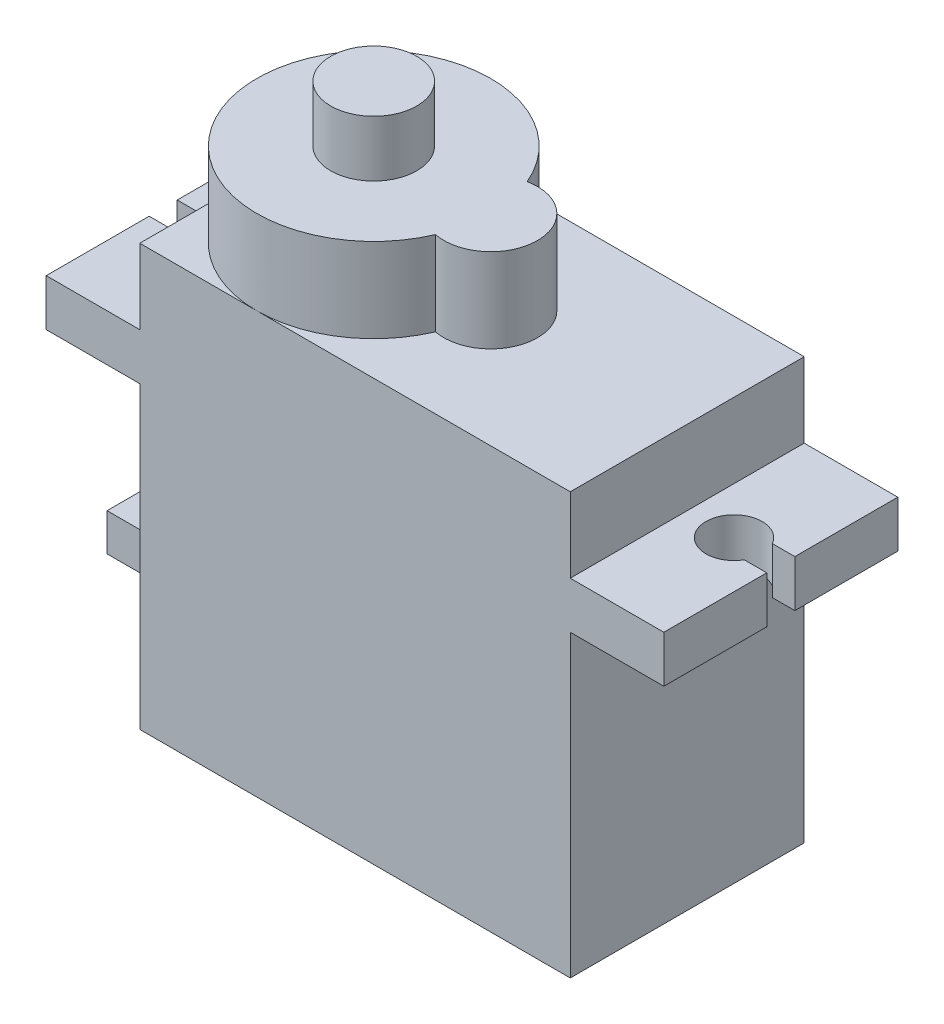
ISO-10303-21;
HEADER;
FILE_DESCRIPTION(('STEP AP214'),'2;1');
FILE_NAME('part.step','',(''),(''),'','','');
FILE_SCHEMA(('AUTOMOTIVE_DESIGN { 1 0 10303 214 1 1 1 1 }'));
ENDSEC;
DATA;
#1=APPLICATION_CONTEXT('core data for automotive mechanical design processes');
#2=APPLICATION_PROTOCOL_DEFINITION('international standard','automotive_design',2000,#1);
#3=PRODUCT_CONTEXT('',#1,'mechanical');
#4=PRODUCT('Part','Part','',(#3));
#5=PRODUCT_RELATED_PRODUCT_CATEGORY('part','',(#4));
#6=PRODUCT_DEFINITION_FORMATION('','',#4);
#7=PRODUCT_DEFINITION_CONTEXT('part definition',#1,'design');
#8=PRODUCT_DEFINITION('design','',#6,#7);
#9=PRODUCT_DEFINITION_SHAPE('','',#8);
#10=(LENGTH_UNIT() NAMED_UNIT(*) SI_UNIT(.MILLI.,.METRE.));
#11=(NAMED_UNIT(*) PLANE_ANGLE_UNIT() SI_UNIT($,.RADIAN.));
#12=(NAMED_UNIT(*) SI_UNIT($,.STERADIAN.) SOLID_ANGLE_UNIT());
#13=UNCERTAINTY_MEASURE_WITH_UNIT(LENGTH_MEASURE(1.E-05),#10,'distance_accuracy_value','');
#14=(GEOMETRIC_REPRESENTATION_CONTEXT(3) GLOBAL_UNCERTAINTY_ASSIGNED_CONTEXT((#13)) GLOBAL_UNIT_ASSIGNED_CONTEXT((#10,
#11,#12)) REPRESENTATION_CONTEXT('',''));
#15=CARTESIAN_POINT('',(0.,0.,0.));
#16=DIRECTION('',(0.,0.,1.));
#17=DIRECTION('',(1.,0.,0.));
#18=AXIS2_PLACEMENT_3D('',#15,#16,#17);
#19=CARTESIAN_POINT('',(-11.5,22.5,6.25));
#20=DIRECTION('',(1.,0.,0.));
#21=DIRECTION('',(0.,0.,-1.));
#22=AXIS2_PLACEMENT_3D('',#19,#20,#21);
#23=PLANE('',#22);
#24=DIRECTION('',(0.,-1.,0.));
#25=VECTOR('',#24,1.);
#26=CARTESIAN_POINT('',(-11.5,22.5,6.25));
#27=LINE('',#26,#25);
#28=CARTESIAN_POINT('',(-11.5,16.,6.25));
#29=VERTEX_POINT('',#28);
#30=CARTESIAN_POINT('',(-11.5,0.,6.25));
#31=VERTEX_POINT('',#30);
#32=EDGE_CURVE('E411',#29,#31,#27,.T.);
#33=ORIENTED_EDGE('',*,*,#32,.F.);
#34=DIRECTION('',(0.,0.,-1.));
#35=VECTOR('',#34,1.);
#36=CARTESIAN_POINT('',(-11.5,16.,-6.25));
#37=LINE('',#36,#35);
#38=CARTESIAN_POINT('',(-11.5,16.,-6.25));
#39=VERTEX_POINT('',#38);
#40=EDGE_CURVE('E328',#29,#39,#37,.T.);
#41=ORIENTED_EDGE('',*,*,#40,.T.);
#42=DIRECTION('',(0.,-1.,0.));
#43=VECTOR('',#42,1.);
#44=CARTESIAN_POINT('',(-11.5,22.5,-6.25));
#45=LINE('',#44,#43);
#46=CARTESIAN_POINT('',(-11.5,0.,-6.25));
#47=VERTEX_POINT('',#46);
#48=EDGE_CURVE('E392',#39,#47,#45,.T.);
#49=ORIENTED_EDGE('',*,*,#48,.T.);
#50=DIRECTION('',(0.,0.,1.));
#51=VECTOR('',#50,1.);
#52=CARTESIAN_POINT('',(-11.5,0.,6.25));
#53=LINE('',#52,#51);
#54=EDGE_CURVE('E378',#47,#31,#53,.T.);
#55=ORIENTED_EDGE('',*,*,#54,.T.);
#56=EDGE_LOOP('',(#33,#41,#49,#55));
#57=FACE_BOUND('',#56,.T.);
#58=DIRECTION('',(0.,1.,0.));
#59=VECTOR('',#58,1.);
#60=CARTESIAN_POINT('',(-11.5,4.,3.));
#61=LINE('',#60,#59);
#62=CARTESIAN_POINT('',(-11.5,4.,3.));
#63=VERTEX_POINT('',#62);
#64=CARTESIAN_POINT('',(-11.5,6.,3.));
#65=VERTEX_POINT('',#64);
#66=EDGE_CURVE('E243',#63,#65,#61,.T.);
#67=ORIENTED_EDGE('',*,*,#66,.F.);
#68=DIRECTION('',(0.,0.,-1.));
#69=VECTOR('',#68,1.);
#70=CARTESIAN_POINT('',(-11.5,4.,3.));
#71=LINE('',#70,#69);
#72=CARTESIAN_POINT('',(-11.5,4.,-3.));
#73=VERTEX_POINT('',#72);
#74=EDGE_CURVE('E239',#63,#73,#71,.T.);
#75=ORIENTED_EDGE('',*,*,#74,.T.);
#76=DIRECTION('',(0.,1.,0.));
#77=VECTOR('',#76,1.);
#78=CARTESIAN_POINT('',(-11.5,4.,-3.));
#79=LINE('',#78,#77);
#80=CARTESIAN_POINT('',(-11.5,6.,-3.));
#81=VERTEX_POINT('',#80);
#82=EDGE_CURVE('E53',#73,#81,#79,.T.);
#83=ORIENTED_EDGE('',*,*,#82,.T.);
#84=DIRECTION('',(0.,0.,-1.));
#85=VECTOR('',#84,1.);
#86=CARTESIAN_POINT('',(-11.5,6.,3.));
#87=LINE('',#86,#85);
#88=EDGE_CURVE('E486',#65,#81,#87,.T.);
#89=ORIENTED_EDGE('',*,*,#88,.F.);
#90=EDGE_LOOP('',(#67,#75,#83,#89));
#91=FACE_BOUND('',#90,.T.);
#92=ADVANCED_FACE('F36',(#57,#91),#23,.F.);
#93=CARTESIAN_POINT('',(0.,22.5,0.));
#94=DIRECTION('',(0.,1.,0.));
#95=DIRECTION('',(0.,0.,1.));
#96=AXIS2_PLACEMENT_3D('',#93,#94,#95);
#97=PLANE('',#96);
#98=CARTESIAN_POINT('',(1.00000000000001,22.5,0.));
#99=DIRECTION('',(0.,1.,0.));
#100=DIRECTION('',(0.,0.,1.));
#101=AXIS2_PLACEMENT_3D('',#98,#99,#100);
#102=CIRCLE('',#101,2.5);
#103=CARTESIAN_POINT('',(0.500000000000007,22.5,2.44948974278318));
#104=VERTEX_POINT('',#103);
#105=CARTESIAN_POINT('',(0.500000000000007,22.5,-2.44948974278318));
#106=VERTEX_POINT('',#105);
#107=EDGE_CURVE('E255',#104,#106,#102,.T.);
#108=ORIENTED_EDGE('',*,*,#107,.F.);
#109=CARTESIAN_POINT('',(-5.24999999999999,22.5,0.));
#110=DIRECTION('',(0.,1.,0.));
#111=DIRECTION('',(0.,0.,1.));
#112=AXIS2_PLACEMENT_3D('',#109,#110,#111);
#113=CIRCLE('',#112,6.25);
#114=CARTESIAN_POINT('',(-5.24999999999999,22.5,6.25));
#115=VERTEX_POINT('',#114);
#116=EDGE_CURVE('E265',#115,#104,#113,.T.);
#117=ORIENTED_EDGE('',*,*,#116,.F.);
#118=DIRECTION('',(1.,0.,0.));
#119=VECTOR('',#118,1.);
#120=CARTESIAN_POINT('',(11.5,22.5,6.25));
#121=LINE('',#120,#119);
#122=CARTESIAN_POINT('',(11.5,22.5,6.25));
#123=VERTEX_POINT('',#122);
#124=EDGE_CURVE('E382',#115,#123,#121,.T.);
#125=ORIENTED_EDGE('',*,*,#124,.T.);
#126=DIRECTION('',(0.,0.,-1.));
#127=VECTOR('',#126,1.);
#128=CARTESIAN_POINT('',(11.5,22.5,6.25));
#129=LINE('',#128,#127);
#130=CARTESIAN_POINT('',(11.5,22.5,-6.25));
#131=VERTEX_POINT('',#130);
#132=EDGE_CURVE('E387',#123,#131,#129,.T.);
#133=ORIENTED_EDGE('',*,*,#132,.T.);
#134=DIRECTION('',(-1.,0.,0.));
#135=VECTOR('',#134,1.);
#136=CARTESIAN_POINT('',(11.5,22.5,-6.25));
#137=LINE('',#136,#135);
#138=CARTESIAN_POINT('',(-5.24999999999999,22.5,-6.25));
#139=VERTEX_POINT('',#138);
#140=EDGE_CURVE('E390',#131,#139,#137,.T.);
#141=ORIENTED_EDGE('',*,*,#140,.T.);
#142=EDGE_CURVE('E46',#106,#139,#113,.T.);
#143=ORIENTED_EDGE('',*,*,#142,.F.);
#144=EDGE_LOOP('',(#108,#117,#125,#133,#141,#143));
#145=FACE_BOUND('',#144,.T.);
#146=ADVANCED_FACE('F455',(#145),#97,.T.);
#147=CARTESIAN_POINT('',(-11.5,22.5,0.));
#148=VERTEX_POINT('',#147);
#149=EDGE_CURVE('E11',#139,#148,#113,.T.);
#150=ORIENTED_EDGE('',*,*,#149,.F.);
#151=CARTESIAN_POINT('',(-11.5,22.5,-6.25));
#152=VERTEX_POINT('',#151);
#153=EDGE_CURVE('E389',#139,#152,#137,.T.);
#154=ORIENTED_EDGE('',*,*,#153,.T.);
#155=DIRECTION('',(0.,0.,1.));
#156=VECTOR('',#155,1.);
#157=CARTESIAN_POINT('',(-11.5,22.5,6.25));
#158=LINE('',#157,#156);
#159=EDGE_CURVE('E379',#152,#148,#158,.T.);
#160=ORIENTED_EDGE('',*,*,#159,.T.);
#161=EDGE_LOOP('',(#150,#154,#160));
#162=FACE_BOUND('',#161,.T.);
#163=ADVANCED_FACE('F577',(#162),#97,.T.);
#164=CARTESIAN_POINT('',(11.5,22.5,6.25));
#165=DIRECTION('',(-1.,0.,0.));
#166=DIRECTION('',(0.,0.,1.));
#167=AXIS2_PLACEMENT_3D('',#164,#165,#166);
#168=PLANE('',#167);
#169=DIRECTION('',(0.,0.,1.));
#170=VECTOR('',#169,1.);
#171=CARTESIAN_POINT('',(11.5,18.5,-6.25));
#172=LINE('',#171,#170);
#173=CARTESIAN_POINT('',(11.5,18.5,-6.25));
#174=VERTEX_POINT('',#173);
#175=CARTESIAN_POINT('',(11.5,18.5,6.25));
#176=VERTEX_POINT('',#175);
#177=EDGE_CURVE('E271',#174,#176,#172,.T.);
#178=ORIENTED_EDGE('',*,*,#177,.F.);
#179=DIRECTION('',(0.,-1.,0.));
#180=VECTOR('',#179,1.);
#181=CARTESIAN_POINT('',(11.5,22.5,-6.25));
#182=LINE('',#181,#180);
#183=EDGE_CURVE('E407',#131,#174,#182,.T.);
#184=ORIENTED_EDGE('',*,*,#183,.F.);
#185=ORIENTED_EDGE('',*,*,#132,.F.);
#186=DIRECTION('',(0.,-1.,0.));
#187=VECTOR('',#186,1.);
#188=CARTESIAN_POINT('',(11.5,22.5,6.25));
#189=LINE('',#188,#187);
#190=EDGE_CURVE('E410',#123,#176,#189,.T.);
#191=ORIENTED_EDGE('',*,*,#190,.T.);
#192=EDGE_LOOP('',(#178,#184,#185,#191));
#193=FACE_BOUND('',#192,.T.);
#194=ADVANCED_FACE('F453',(#193),#168,.F.);
#195=DIRECTION('',(0.,0.,-1.));
#196=VECTOR('',#195,1.);
#197=CARTESIAN_POINT('',(-11.5,18.5,-6.25));
#198=LINE('',#197,#196);
#199=CARTESIAN_POINT('',(-11.5,18.5,6.25));
#200=VERTEX_POINT('',#199);
#201=CARTESIAN_POINT('',(-11.5,18.5,-6.25));
#202=VERTEX_POINT('',#201);
#203=EDGE_CURVE('E341',#200,#202,#198,.T.);
#204=ORIENTED_EDGE('',*,*,#203,.F.);
#205=CARTESIAN_POINT('',(-11.5,22.5,6.25));
#206=VERTEX_POINT('',#205);
#207=EDGE_CURVE('E39',#206,#200,#27,.T.);
#208=ORIENTED_EDGE('',*,*,#207,.F.);
#209=EDGE_CURVE('E383',#148,#206,#158,.T.);
#210=ORIENTED_EDGE('',*,*,#209,.F.);
#211=ORIENTED_EDGE('',*,*,#159,.F.);
#212=EDGE_CURVE('E404',#152,#202,#45,.T.);
#213=ORIENTED_EDGE('',*,*,#212,.T.);
#214=EDGE_LOOP('',(#204,#208,#210,#211,#213));
#215=FACE_BOUND('',#214,.T.);
#216=ADVANCED_FACE('F483',(#215),#23,.F.);
#217=CARTESIAN_POINT('',(11.5,22.5,6.25));
#218=DIRECTION('',(0.,0.,-1.));
#219=DIRECTION('',(-1.,0.,0.));
#220=AXIS2_PLACEMENT_3D('',#217,#218,#219);
#221=PLANE('',#220);
#222=DIRECTION('',(1.,0.,0.));
#223=VECTOR('',#222,1.);
#224=CARTESIAN_POINT('',(11.5,0.,6.25));
#225=LINE('',#224,#223);
#226=CARTESIAN_POINT('',(11.5,0.,6.25));
#227=VERTEX_POINT('',#226);
#228=EDGE_CURVE('E395',#31,#227,#225,.T.);
#229=ORIENTED_EDGE('',*,*,#228,.T.);
#230=CARTESIAN_POINT('',(11.5,16.,6.25));
#231=VERTEX_POINT('',#230);
#232=EDGE_CURVE('E409',#231,#227,#189,.T.);
#233=ORIENTED_EDGE('',*,*,#232,.F.);
#234=DIRECTION('',(1.,0.,0.));
#235=VECTOR('',#234,1.);
#236=CARTESIAN_POINT('',(16.5,16.,6.25));
#237=LINE('',#236,#235);
#238=CARTESIAN_POINT('',(16.5,16.,6.25));
#239=VERTEX_POINT('',#238);
#240=EDGE_CURVE('E292',#231,#239,#237,.T.);
#241=ORIENTED_EDGE('',*,*,#240,.T.);
#242=DIRECTION('',(0.,-1.,0.));
#243=VECTOR('',#242,1.);
#244=CARTESIAN_POINT('',(16.5,18.5,6.25));
#245=LINE('',#244,#243);
#246=CARTESIAN_POINT('',(16.5,18.5,6.25));
#247=VERTEX_POINT('',#246);
#248=EDGE_CURVE('E320',#247,#239,#245,.T.);
#249=ORIENTED_EDGE('',*,*,#248,.F.);
#250=DIRECTION('',(1.,0.,0.));
#251=VECTOR('',#250,1.);
#252=CARTESIAN_POINT('',(16.5,18.5,6.25));
#253=LINE('',#252,#251);
#254=EDGE_CURVE('E274',#176,#247,#253,.T.);
#255=ORIENTED_EDGE('',*,*,#254,.F.);
#256=ORIENTED_EDGE('',*,*,#190,.F.);
#257=ORIENTED_EDGE('',*,*,#124,.F.);
#258=EDGE_CURVE('E384',#206,#115,#121,.T.);
#259=ORIENTED_EDGE('',*,*,#258,.F.);
#260=ORIENTED_EDGE('',*,*,#207,.T.);
#261=DIRECTION('',(1.,0.,0.));
#262=VECTOR('',#261,1.);
#263=CARTESIAN_POINT('',(-16.5,18.5,6.25));
#264=LINE('',#263,#262);
#265=CARTESIAN_POINT('',(-16.5,18.5,6.25));
#266=VERTEX_POINT('',#265);
#267=EDGE_CURVE('E338',#266,#200,#264,.T.);
#268=ORIENTED_EDGE('',*,*,#267,.F.);
#269=DIRECTION('',(0.,-1.,0.));
#270=VECTOR('',#269,1.);
#271=CARTESIAN_POINT('',(-16.5,18.5,6.25));
#272=LINE('',#271,#270);
#273=CARTESIAN_POINT('',(-16.5,16.,6.25));
#274=VERTEX_POINT('',#273);
#275=EDGE_CURVE('E344',#266,#274,#272,.T.);
#276=ORIENTED_EDGE('',*,*,#275,.T.);
#277=DIRECTION('',(1.,0.,0.));
#278=VECTOR('',#277,1.);
#279=CARTESIAN_POINT('',(-16.5,16.,6.25));
#280=LINE('',#279,#278);
#281=EDGE_CURVE('E357',#274,#29,#280,.T.);
#282=ORIENTED_EDGE('',*,*,#281,.T.);
#283=ORIENTED_EDGE('',*,*,#32,.T.);
#284=EDGE_LOOP('',(#229,#233,#241,#249,#255,#256,#257,#259,#260,#268,#276,#282,#283));
#285=FACE_BOUND('',#284,.T.);
#286=ADVANCED_FACE('F425',(#285),#221,.F.);
#287=CARTESIAN_POINT('',(11.5,16.,-6.25));
#288=VERTEX_POINT('',#287);
#289=CARTESIAN_POINT('',(11.5,0.,-6.25));
#290=VERTEX_POINT('',#289);
#291=EDGE_CURVE('E406',#288,#290,#182,.T.);
#292=ORIENTED_EDGE('',*,*,#291,.F.);
#293=DIRECTION('',(0.,0.,1.));
#294=VECTOR('',#293,1.);
#295=CARTESIAN_POINT('',(11.5,16.,-6.25));
#296=LINE('',#295,#294);
#297=EDGE_CURVE('E270',#288,#231,#296,.T.);
#298=ORIENTED_EDGE('',*,*,#297,.T.);
#299=ORIENTED_EDGE('',*,*,#232,.T.);
#300=DIRECTION('',(0.,0.,-1.));
#301=VECTOR('',#300,1.);
#302=CARTESIAN_POINT('',(11.5,0.,6.25));
#303=LINE('',#302,#301);
#304=EDGE_CURVE('E398',#227,#290,#303,.T.);
#305=ORIENTED_EDGE('',*,*,#304,.T.);
#306=EDGE_LOOP('',(#292,#298,#299,#305));
#307=FACE_BOUND('',#306,.T.);
#308=ADVANCED_FACE('F418',(#307),#168,.F.);
#309=CARTESIAN_POINT('',(11.5,22.5,-6.25));
#310=DIRECTION('',(0.,0.,1.));
#311=DIRECTION('',(1.,0.,0.));
#312=AXIS2_PLACEMENT_3D('',#309,#310,#311);
#313=PLANE('',#312);
#314=DIRECTION('',(-1.,0.,0.));
#315=VECTOR('',#314,1.);
#316=CARTESIAN_POINT('',(11.5,0.,-6.25));
#317=LINE('',#316,#315);
#318=EDGE_CURVE('E401',#290,#47,#317,.T.);
#319=ORIENTED_EDGE('',*,*,#318,.T.);
#320=ORIENTED_EDGE('',*,*,#48,.F.);
#321=DIRECTION('',(-1.,0.,0.));
#322=VECTOR('',#321,1.);
#323=CARTESIAN_POINT('',(-11.5,16.,-6.25));
#324=LINE('',#323,#322);
#325=CARTESIAN_POINT('',(-16.5,16.,-6.25));
#326=VERTEX_POINT('',#325);
#327=EDGE_CURVE('E323',#39,#326,#324,.T.);
#328=ORIENTED_EDGE('',*,*,#327,.T.);
#329=DIRECTION('',(0.,-1.,0.));
#330=VECTOR('',#329,1.);
#331=CARTESIAN_POINT('',(-16.5,18.5,-6.25));
#332=LINE('',#331,#330);
#333=CARTESIAN_POINT('',(-16.5,18.5,-6.25));
#334=VERTEX_POINT('',#333);
#335=EDGE_CURVE('E375',#334,#326,#332,.T.);
#336=ORIENTED_EDGE('',*,*,#335,.F.);
#337=DIRECTION('',(-1.,0.,0.));
#338=VECTOR('',#337,1.);
#339=CARTESIAN_POINT('',(-11.5,18.5,-6.25));
#340=LINE('',#339,#338);
#341=EDGE_CURVE('E324',#202,#334,#340,.T.);
#342=ORIENTED_EDGE('',*,*,#341,.F.);
#343=ORIENTED_EDGE('',*,*,#212,.F.);
#344=ORIENTED_EDGE('',*,*,#153,.F.);
#345=ORIENTED_EDGE('',*,*,#140,.F.);
#346=ORIENTED_EDGE('',*,*,#183,.T.);
#347=DIRECTION('',(-1.,0.,0.));
#348=VECTOR('',#347,1.);
#349=CARTESIAN_POINT('',(11.5,18.5,-6.25));
#350=LINE('',#349,#348);
#351=CARTESIAN_POINT('',(16.5,18.5,-6.25));
#352=VERTEX_POINT('',#351);
#353=EDGE_CURVE('E287',#352,#174,#350,.T.);
#354=ORIENTED_EDGE('',*,*,#353,.F.);
#355=DIRECTION('',(0.,-1.,0.));
#356=VECTOR('',#355,1.);
#357=CARTESIAN_POINT('',(16.5,18.5,-6.25));
#358=LINE('',#357,#356);
#359=CARTESIAN_POINT('',(16.5,16.,-6.25));
#360=VERTEX_POINT('',#359);
#361=EDGE_CURVE('E290',#352,#360,#358,.T.);
#362=ORIENTED_EDGE('',*,*,#361,.T.);
#363=DIRECTION('',(-1.,0.,0.));
#364=VECTOR('',#363,1.);
#365=CARTESIAN_POINT('',(11.5,16.,-6.25));
#366=LINE('',#365,#364);
#367=EDGE_CURVE('E275',#360,#288,#366,.T.);
#368=ORIENTED_EDGE('',*,*,#367,.T.);
#369=ORIENTED_EDGE('',*,*,#291,.T.);
#370=EDGE_LOOP('',(#319,#320,#328,#336,#342,#343,#344,#345,#346,#354,#362,#368,#369));
#371=FACE_BOUND('',#370,.T.);
#372=ADVANCED_FACE('F431',(#371),#313,.F.);
#373=EDGE_CURVE('E44',#148,#115,#113,.T.);
#374=ORIENTED_EDGE('',*,*,#373,.F.);
#375=ORIENTED_EDGE('',*,*,#209,.T.);
#376=ORIENTED_EDGE('',*,*,#258,.T.);
#377=EDGE_LOOP('',(#374,#375,#376));
#378=FACE_BOUND('',#377,.T.);
#379=ADVANCED_FACE('F573',(#378),#97,.T.);
#380=CARTESIAN_POINT('',(0.,0.,0.));
#381=DIRECTION('',(0.,1.,0.));
#382=DIRECTION('',(0.,0.,1.));
#383=AXIS2_PLACEMENT_3D('',#380,#381,#382);
#384=PLANE('',#383);
#385=ORIENTED_EDGE('',*,*,#54,.F.);
#386=ORIENTED_EDGE('',*,*,#318,.F.);
#387=ORIENTED_EDGE('',*,*,#304,.F.);
#388=ORIENTED_EDGE('',*,*,#228,.F.);
#389=EDGE_LOOP('',(#385,#386,#387,#388));
#390=FACE_BOUND('',#389,.T.);
#391=ADVANCED_FACE('F428',(#390),#384,.F.);
#392=CARTESIAN_POINT('',(-16.5,18.5,-6.25));
#393=DIRECTION('',(1.,0.,0.));
#394=DIRECTION('',(0.,0.,-1.));
#395=AXIS2_PLACEMENT_3D('',#392,#393,#394);
#396=PLANE('',#395);
#397=DIRECTION('',(0.,0.,1.));
#398=VECTOR('',#397,1.);
#399=CARTESIAN_POINT('',(-16.5,16.,-6.25));
#400=LINE('',#399,#398);
#401=CARTESIAN_POINT('',(-16.5,16.,-0.75));
#402=VERTEX_POINT('',#401);
#403=EDGE_CURVE('E347',#326,#402,#400,.T.);
#404=ORIENTED_EDGE('',*,*,#403,.T.);
#405=DIRECTION('',(0.,-1.,0.));
#406=VECTOR('',#405,1.);
#407=CARTESIAN_POINT('',(-16.5,18.5,-0.75));
#408=LINE('',#407,#406);
#409=CARTESIAN_POINT('',(-16.5,18.5,-0.75));
#410=VERTEX_POINT('',#409);
#411=EDGE_CURVE('E372',#410,#402,#408,.T.);
#412=ORIENTED_EDGE('',*,*,#411,.F.);
#413=DIRECTION('',(0.,0.,1.));
#414=VECTOR('',#413,1.);
#415=CARTESIAN_POINT('',(-16.5,18.5,-6.25));
#416=LINE('',#415,#414);
#417=EDGE_CURVE('E327',#334,#410,#416,.T.);
#418=ORIENTED_EDGE('',*,*,#417,.F.);
#419=ORIENTED_EDGE('',*,*,#335,.T.);
#420=EDGE_LOOP('',(#404,#412,#418,#419));
#421=FACE_BOUND('',#420,.T.);
#422=ADVANCED_FACE('F568',(#421),#396,.F.);
#423=CARTESIAN_POINT('',(-16.5,18.5,-0.75));
#424=DIRECTION('',(0.,0.,-1.));
#425=DIRECTION('',(-1.,0.,0.));
#426=AXIS2_PLACEMENT_3D('',#423,#424,#425);
#427=PLANE('',#426);
#428=DIRECTION('',(1.,0.,0.));
#429=VECTOR('',#428,1.);
#430=CARTESIAN_POINT('',(-16.5,16.,-0.75));
#431=LINE('',#430,#429);
#432=CARTESIAN_POINT('',(-15.2990381056766,16.,-0.750000000000001));
#433=VERTEX_POINT('',#432);
#434=EDGE_CURVE('E349',#402,#433,#431,.T.);
#435=ORIENTED_EDGE('',*,*,#434,.T.);
#436=DIRECTION('',(0.,-1.,0.));
#437=VECTOR('',#436,1.);
#438=CARTESIAN_POINT('',(-15.2990381056766,18.5,-0.750000000000001));
#439=LINE('',#438,#437);
#440=CARTESIAN_POINT('',(-15.2990381056766,18.5,-0.750000000000001));
#441=VERTEX_POINT('',#440);
#442=EDGE_CURVE('E369',#441,#433,#439,.T.);
#443=ORIENTED_EDGE('',*,*,#442,.F.);
#444=DIRECTION('',(1.,0.,0.));
#445=VECTOR('',#444,1.);
#446=CARTESIAN_POINT('',(-16.5,18.5,-0.75));
#447=LINE('',#446,#445);
#448=EDGE_CURVE('E330',#410,#441,#447,.T.);
#449=ORIENTED_EDGE('',*,*,#448,.F.);
#450=ORIENTED_EDGE('',*,*,#411,.T.);
#451=EDGE_LOOP('',(#435,#443,#449,#450));
#452=FACE_BOUND('',#451,.T.);
#453=ADVANCED_FACE('F564',(#452),#427,.F.);
#454=CARTESIAN_POINT('',(-14.,18.5,0.));
#455=DIRECTION('',(0.,-1.,0.));
#456=DIRECTION('',(0.,0.,-1.));
#457=AXIS2_PLACEMENT_3D('',#454,#455,#456);
#458=CYLINDRICAL_SURFACE('',#457,1.5);
#459=CARTESIAN_POINT('',(-14.,16.,0.));
#460=DIRECTION('',(0.,-1.,0.));
#461=DIRECTION('',(0.,0.,1.));
#462=AXIS2_PLACEMENT_3D('',#459,#460,#461);
#463=CIRCLE('',#462,1.5);
#464=CARTESIAN_POINT('',(-15.2990381056767,16.,0.75));
#465=VERTEX_POINT('',#464);
#466=EDGE_CURVE('E351',#433,#465,#463,.T.);
#467=ORIENTED_EDGE('',*,*,#466,.T.);
#468=DIRECTION('',(0.,-1.,0.));
#469=VECTOR('',#468,1.);
#470=CARTESIAN_POINT('',(-15.2990381056767,18.5,0.75));
#471=LINE('',#470,#469);
#472=CARTESIAN_POINT('',(-15.2990381056767,18.5,0.75));
#473=VERTEX_POINT('',#472);
#474=EDGE_CURVE('E366',#473,#465,#471,.T.);
#475=ORIENTED_EDGE('',*,*,#474,.F.);
#476=CARTESIAN_POINT('',(-14.,18.5,0.));
#477=DIRECTION('',(0.,-1.,0.));
#478=DIRECTION('',(0.,0.,1.));
#479=AXIS2_PLACEMENT_3D('',#476,#477,#478);
#480=CIRCLE('',#479,1.5);
#481=EDGE_CURVE('E332',#441,#473,#480,.T.);
#482=ORIENTED_EDGE('',*,*,#481,.F.);
#483=ORIENTED_EDGE('',*,*,#442,.T.);
#484=EDGE_LOOP('',(#467,#475,#482,#483));
#485=FACE_BOUND('',#484,.T.);
#486=ADVANCED_FACE('F560',(#485),#458,.F.);
#487=CARTESIAN_POINT('',(-16.5,18.5,0.75));
#488=DIRECTION('',(0.,0.,1.));
#489=DIRECTION('',(1.,0.,0.));
#490=AXIS2_PLACEMENT_3D('',#487,#488,#489);
#491=PLANE('',#490);
#492=DIRECTION('',(-1.,0.,0.));
#493=VECTOR('',#492,1.);
#494=CARTESIAN_POINT('',(-16.5,16.,0.75));
#495=LINE('',#494,#493);
#496=CARTESIAN_POINT('',(-16.5,16.,0.75));
#497=VERTEX_POINT('',#496);
#498=EDGE_CURVE('E353',#465,#497,#495,.T.);
#499=ORIENTED_EDGE('',*,*,#498,.T.);
#500=DIRECTION('',(0.,-1.,0.));
#501=VECTOR('',#500,1.);
#502=CARTESIAN_POINT('',(-16.5,18.5,0.75));
#503=LINE('',#502,#501);
#504=CARTESIAN_POINT('',(-16.5,18.5,0.75));
#505=VERTEX_POINT('',#504);
#506=EDGE_CURVE('E363',#505,#497,#503,.T.);
#507=ORIENTED_EDGE('',*,*,#506,.F.);
#508=DIRECTION('',(-1.,0.,0.));
#509=VECTOR('',#508,1.);
#510=CARTESIAN_POINT('',(-16.5,18.5,0.75));
#511=LINE('',#510,#509);
#512=EDGE_CURVE('E334',#473,#505,#511,.T.);
#513=ORIENTED_EDGE('',*,*,#512,.F.);
#514=ORIENTED_EDGE('',*,*,#474,.T.);
#515=EDGE_LOOP('',(#499,#507,#513,#514));
#516=FACE_BOUND('',#515,.T.);
#517=ADVANCED_FACE('F557',(#516),#491,.F.);
#518=CARTESIAN_POINT('',(-16.5,18.5,0.75));
#519=DIRECTION('',(1.,0.,0.));
#520=DIRECTION('',(0.,0.,-1.));
#521=AXIS2_PLACEMENT_3D('',#518,#519,#520);
#522=PLANE('',#521);
#523=DIRECTION('',(0.,0.,1.));
#524=VECTOR('',#523,1.);
#525=CARTESIAN_POINT('',(-16.5,16.,0.75));
#526=LINE('',#525,#524);
#527=EDGE_CURVE('E355',#497,#274,#526,.T.);
#528=ORIENTED_EDGE('',*,*,#527,.T.);
#529=ORIENTED_EDGE('',*,*,#275,.F.);
#530=DIRECTION('',(0.,0.,1.));
#531=VECTOR('',#530,1.);
#532=CARTESIAN_POINT('',(-16.5,18.5,0.75));
#533=LINE('',#532,#531);
#534=EDGE_CURVE('E336',#505,#266,#533,.T.);
#535=ORIENTED_EDGE('',*,*,#534,.F.);
#536=ORIENTED_EDGE('',*,*,#506,.T.);
#537=EDGE_LOOP('',(#528,#529,#535,#536));
#538=FACE_BOUND('',#537,.T.);
#539=ADVANCED_FACE('F473',(#538),#522,.F.);
#540=CARTESIAN_POINT('',(-14.,18.5,0.));
#541=DIRECTION('',(0.,1.,0.));
#542=DIRECTION('',(0.,0.,1.));
#543=AXIS2_PLACEMENT_3D('',#540,#541,#542);
#544=PLANE('',#543);
#545=ORIENTED_EDGE('',*,*,#341,.T.);
#546=ORIENTED_EDGE('',*,*,#417,.T.);
#547=ORIENTED_EDGE('',*,*,#448,.T.);
#548=ORIENTED_EDGE('',*,*,#481,.T.);
#549=ORIENTED_EDGE('',*,*,#512,.T.);
#550=ORIENTED_EDGE('',*,*,#534,.T.);
#551=ORIENTED_EDGE('',*,*,#267,.T.);
#552=ORIENTED_EDGE('',*,*,#203,.T.);
#553=EDGE_LOOP('',(#545,#546,#547,#548,#549,#550,#551,#552));
#554=FACE_BOUND('',#553,.T.);
#555=ADVANCED_FACE('F466',(#554),#544,.T.);
#556=CARTESIAN_POINT('',(-14.,16.,0.));
#557=DIRECTION('',(0.,1.,0.));
#558=DIRECTION('',(0.,0.,1.));
#559=AXIS2_PLACEMENT_3D('',#556,#557,#558);
#560=PLANE('',#559);
#561=ORIENTED_EDGE('',*,*,#327,.F.);
#562=ORIENTED_EDGE('',*,*,#40,.F.);
#563=ORIENTED_EDGE('',*,*,#281,.F.);
#564=ORIENTED_EDGE('',*,*,#527,.F.);
#565=ORIENTED_EDGE('',*,*,#498,.F.);
#566=ORIENTED_EDGE('',*,*,#466,.F.);
#567=ORIENTED_EDGE('',*,*,#434,.F.);
#568=ORIENTED_EDGE('',*,*,#403,.F.);
#569=EDGE_LOOP('',(#561,#562,#563,#564,#565,#566,#567,#568));
#570=FACE_BOUND('',#569,.T.);
#571=ADVANCED_FACE('F478',(#570),#560,.F.);
#572=CARTESIAN_POINT('',(16.5,18.5,0.75));
#573=DIRECTION('',(-1.,0.,0.));
#574=DIRECTION('',(0.,0.,1.));
#575=AXIS2_PLACEMENT_3D('',#572,#573,#574);
#576=PLANE('',#575);
#577=DIRECTION('',(0.,0.,-1.));
#578=VECTOR('',#577,1.);
#579=CARTESIAN_POINT('',(16.5,16.,0.75));
#580=LINE('',#579,#578);
#581=CARTESIAN_POINT('',(16.5,16.,0.75));
#582=VERTEX_POINT('',#581);
#583=EDGE_CURVE('E294',#239,#582,#580,.T.);
#584=ORIENTED_EDGE('',*,*,#583,.T.);
#585=DIRECTION('',(0.,-1.,0.));
#586=VECTOR('',#585,1.);
#587=CARTESIAN_POINT('',(16.5,18.5,0.75));
#588=LINE('',#587,#586);
#589=CARTESIAN_POINT('',(16.5,18.5,0.75));
#590=VERTEX_POINT('',#589);
#591=EDGE_CURVE('E317',#590,#582,#588,.T.);
#592=ORIENTED_EDGE('',*,*,#591,.F.);
#593=DIRECTION('',(0.,0.,-1.));
#594=VECTOR('',#593,1.);
#595=CARTESIAN_POINT('',(16.5,18.5,0.75));
#596=LINE('',#595,#594);
#597=EDGE_CURVE('E277',#247,#590,#596,.T.);
#598=ORIENTED_EDGE('',*,*,#597,.F.);
#599=ORIENTED_EDGE('',*,*,#248,.T.);
#600=EDGE_LOOP('',(#584,#592,#598,#599));
#601=FACE_BOUND('',#600,.T.);
#602=ADVANCED_FACE('F444',(#601),#576,.F.);
#603=CARTESIAN_POINT('',(16.5,18.5,0.75));
#604=DIRECTION('',(0.,0.,1.));
#605=DIRECTION('',(1.,0.,0.));
#606=AXIS2_PLACEMENT_3D('',#603,#604,#605);
#607=PLANE('',#606);
#608=DIRECTION('',(-1.,0.,0.));
#609=VECTOR('',#608,1.);
#610=CARTESIAN_POINT('',(16.5,16.,0.75));
#611=LINE('',#610,#609);
#612=CARTESIAN_POINT('',(15.2990381056767,16.,0.75));
#613=VERTEX_POINT('',#612);
#614=EDGE_CURVE('E296',#582,#613,#611,.T.);
#615=ORIENTED_EDGE('',*,*,#614,.T.);
#616=DIRECTION('',(0.,-1.,0.));
#617=VECTOR('',#616,1.);
#618=CARTESIAN_POINT('',(15.2990381056767,18.5,0.75));
#619=LINE('',#618,#617);
#620=CARTESIAN_POINT('',(15.2990381056767,18.5,0.75));
#621=VERTEX_POINT('',#620);
#622=EDGE_CURVE('E314',#621,#613,#619,.T.);
#623=ORIENTED_EDGE('',*,*,#622,.F.);
#624=DIRECTION('',(-1.,0.,0.));
#625=VECTOR('',#624,1.);
#626=CARTESIAN_POINT('',(16.5,18.5,0.75));
#627=LINE('',#626,#625);
#628=EDGE_CURVE('E279',#590,#621,#627,.T.);
#629=ORIENTED_EDGE('',*,*,#628,.F.);
#630=ORIENTED_EDGE('',*,*,#591,.T.);
#631=EDGE_LOOP('',(#615,#623,#629,#630));
#632=FACE_BOUND('',#631,.T.);
#633=ADVANCED_FACE('F544',(#632),#607,.F.);
#634=CARTESIAN_POINT('',(14.,18.5,0.));
#635=DIRECTION('',(0.,-1.,0.));
#636=DIRECTION('',(0.,0.,-1.));
#637=AXIS2_PLACEMENT_3D('',#634,#635,#636);
#638=CYLINDRICAL_SURFACE('',#637,1.5);
#639=CARTESIAN_POINT('',(14.,16.,0.));
#640=DIRECTION('',(0.,-1.,0.));
#641=DIRECTION('',(0.,0.,-1.));
#642=AXIS2_PLACEMENT_3D('',#639,#640,#641);
#643=CIRCLE('',#642,1.5);
#644=CARTESIAN_POINT('',(15.2990381056767,16.,-0.75));
#645=VERTEX_POINT('',#644);
#646=EDGE_CURVE('E298',#613,#645,#643,.T.);
#647=ORIENTED_EDGE('',*,*,#646,.T.);
#648=DIRECTION('',(0.,-1.,0.));
#649=VECTOR('',#648,1.);
#650=CARTESIAN_POINT('',(15.2990381056767,18.5,-0.75));
#651=LINE('',#650,#649);
#652=CARTESIAN_POINT('',(15.2990381056767,18.5,-0.75));
#653=VERTEX_POINT('',#652);
#654=EDGE_CURVE('E311',#653,#645,#651,.T.);
#655=ORIENTED_EDGE('',*,*,#654,.F.);
#656=CARTESIAN_POINT('',(14.,18.5,0.));
#657=DIRECTION('',(0.,-1.,0.));
#658=DIRECTION('',(0.,0.,-1.));
#659=AXIS2_PLACEMENT_3D('',#656,#657,#658);
#660=CIRCLE('',#659,1.5);
#661=EDGE_CURVE('E281',#621,#653,#660,.T.);
#662=ORIENTED_EDGE('',*,*,#661,.F.);
#663=ORIENTED_EDGE('',*,*,#622,.T.);
#664=EDGE_LOOP('',(#647,#655,#662,#663));
#665=FACE_BOUND('',#664,.T.);
#666=ADVANCED_FACE('F540',(#665),#638,.F.);
#667=CARTESIAN_POINT('',(16.5,18.5,-0.75));
#668=DIRECTION('',(0.,0.,-1.));
#669=DIRECTION('',(-1.,0.,0.));
#670=AXIS2_PLACEMENT_3D('',#667,#668,#669);
#671=PLANE('',#670);
#672=DIRECTION('',(1.,0.,0.));
#673=VECTOR('',#672,1.);
#674=CARTESIAN_POINT('',(16.5,16.,-0.75));
#675=LINE('',#674,#673);
#676=CARTESIAN_POINT('',(16.5,16.,-0.75));
#677=VERTEX_POINT('',#676);
#678=EDGE_CURVE('E300',#645,#677,#675,.T.);
#679=ORIENTED_EDGE('',*,*,#678,.T.);
#680=DIRECTION('',(0.,-1.,0.));
#681=VECTOR('',#680,1.);
#682=CARTESIAN_POINT('',(16.5,18.5,-0.75));
#683=LINE('',#682,#681);
#684=CARTESIAN_POINT('',(16.5,18.5,-0.75));
#685=VERTEX_POINT('',#684);
#686=EDGE_CURVE('E308',#685,#677,#683,.T.);
#687=ORIENTED_EDGE('',*,*,#686,.F.);
#688=DIRECTION('',(1.,0.,0.));
#689=VECTOR('',#688,1.);
#690=CARTESIAN_POINT('',(16.5,18.5,-0.75));
#691=LINE('',#690,#689);
#692=EDGE_CURVE('E283',#653,#685,#691,.T.);
#693=ORIENTED_EDGE('',*,*,#692,.F.);
#694=ORIENTED_EDGE('',*,*,#654,.T.);
#695=EDGE_LOOP('',(#679,#687,#693,#694));
#696=FACE_BOUND('',#695,.T.);
#697=ADVANCED_FACE('F536',(#696),#671,.F.);
#698=CARTESIAN_POINT('',(16.5,18.5,-6.25));
#699=DIRECTION('',(-1.,0.,0.));
#700=DIRECTION('',(0.,0.,1.));
#701=AXIS2_PLACEMENT_3D('',#698,#699,#700);
#702=PLANE('',#701);
#703=DIRECTION('',(0.,0.,-1.));
#704=VECTOR('',#703,1.);
#705=CARTESIAN_POINT('',(16.5,16.,-6.25));
#706=LINE('',#705,#704);
#707=EDGE_CURVE('E302',#677,#360,#706,.T.);
#708=ORIENTED_EDGE('',*,*,#707,.T.);
#709=ORIENTED_EDGE('',*,*,#361,.F.);
#710=DIRECTION('',(0.,0.,-1.));
#711=VECTOR('',#710,1.);
#712=CARTESIAN_POINT('',(16.5,18.5,-6.25));
#713=LINE('',#712,#711);
#714=EDGE_CURVE('E285',#685,#352,#713,.T.);
#715=ORIENTED_EDGE('',*,*,#714,.F.);
#716=ORIENTED_EDGE('',*,*,#686,.T.);
#717=EDGE_LOOP('',(#708,#709,#715,#716));
#718=FACE_BOUND('',#717,.T.);
#719=ADVANCED_FACE('F531',(#718),#702,.F.);
#720=CARTESIAN_POINT('',(14.,18.5,0.));
#721=DIRECTION('',(0.,-1.,0.));
#722=DIRECTION('',(0.,0.,-1.));
#723=AXIS2_PLACEMENT_3D('',#720,#721,#722);
#724=PLANE('',#723);
#725=ORIENTED_EDGE('',*,*,#177,.T.);
#726=ORIENTED_EDGE('',*,*,#254,.T.);
#727=ORIENTED_EDGE('',*,*,#597,.T.);
#728=ORIENTED_EDGE('',*,*,#628,.T.);
#729=ORIENTED_EDGE('',*,*,#661,.T.);
#730=ORIENTED_EDGE('',*,*,#692,.T.);
#731=ORIENTED_EDGE('',*,*,#714,.T.);
#732=ORIENTED_EDGE('',*,*,#353,.T.);
#733=EDGE_LOOP('',(#725,#726,#727,#728,#729,#730,#731,#732));
#734=FACE_BOUND('',#733,.T.);
#735=ADVANCED_FACE('F448',(#734),#724,.F.);
#736=CARTESIAN_POINT('',(14.,16.,0.));
#737=DIRECTION('',(0.,-1.,0.));
#738=DIRECTION('',(0.,0.,-1.));
#739=AXIS2_PLACEMENT_3D('',#736,#737,#738);
#740=PLANE('',#739);
#741=ORIENTED_EDGE('',*,*,#297,.F.);
#742=ORIENTED_EDGE('',*,*,#367,.F.);
#743=ORIENTED_EDGE('',*,*,#707,.F.);
#744=ORIENTED_EDGE('',*,*,#678,.F.);
#745=ORIENTED_EDGE('',*,*,#646,.F.);
#746=ORIENTED_EDGE('',*,*,#614,.F.);
#747=ORIENTED_EDGE('',*,*,#583,.F.);
#748=ORIENTED_EDGE('',*,*,#240,.F.);
#749=EDGE_LOOP('',(#741,#742,#743,#744,#745,#746,#747,#748));
#750=FACE_BOUND('',#749,.T.);
#751=ADVANCED_FACE('F438',(#750),#740,.T.);
#752=CARTESIAN_POINT('',(1.00000000000001,27.,0.));
#753=DIRECTION('',(0.,-1.,0.));
#754=DIRECTION('',(0.,0.,-1.));
#755=AXIS2_PLACEMENT_3D('',#752,#753,#754);
#756=CYLINDRICAL_SURFACE('',#755,2.5);
#757=ORIENTED_EDGE('',*,*,#107,.T.);
#758=DIRECTION('',(0.,-1.,0.));
#759=VECTOR('',#758,1.);
#760=CARTESIAN_POINT('',(0.500000000000007,27.,-2.44948974278318));
#761=LINE('',#760,#759);
#762=CARTESIAN_POINT('',(0.500000000000007,27.,-2.44948974278318));
#763=VERTEX_POINT('',#762);
#764=EDGE_CURVE('E268',#763,#106,#761,.T.);
#765=ORIENTED_EDGE('',*,*,#764,.F.);
#766=CARTESIAN_POINT('',(1.00000000000001,27.,0.));
#767=DIRECTION('',(0.,1.,0.));
#768=DIRECTION('',(0.,0.,1.));
#769=AXIS2_PLACEMENT_3D('',#766,#767,#768);
#770=CIRCLE('',#769,2.5);
#771=CARTESIAN_POINT('',(0.500000000000007,27.,2.44948974278318));
#772=VERTEX_POINT('',#771);
#773=EDGE_CURVE('E257',#772,#763,#770,.T.);
#774=ORIENTED_EDGE('',*,*,#773,.F.);
#775=DIRECTION('',(0.,-1.,0.));
#776=VECTOR('',#775,1.);
#777=CARTESIAN_POINT('',(0.500000000000007,27.,2.44948974278318));
#778=LINE('',#777,#776);
#779=EDGE_CURVE('E262',#772,#104,#778,.T.);
#780=ORIENTED_EDGE('',*,*,#779,.T.);
#781=EDGE_LOOP('',(#757,#765,#774,#780));
#782=FACE_BOUND('',#781,.T.);
#783=ADVANCED_FACE('F525',(#782),#756,.T.);
#784=CARTESIAN_POINT('',(-5.24999999999999,27.,0.));
#785=DIRECTION('',(0.,-1.,0.));
#786=DIRECTION('',(0.,0.,-1.));
#787=AXIS2_PLACEMENT_3D('',#784,#785,#786);
#788=CYLINDRICAL_SURFACE('',#787,6.25);
#789=ORIENTED_EDGE('',*,*,#142,.T.);
#790=ORIENTED_EDGE('',*,*,#149,.T.);
#791=ORIENTED_EDGE('',*,*,#373,.T.);
#792=ORIENTED_EDGE('',*,*,#116,.T.);
#793=ORIENTED_EDGE('',*,*,#779,.F.);
#794=CARTESIAN_POINT('',(-5.24999999999999,27.,0.));
#795=DIRECTION('',(0.,1.,0.));
#796=DIRECTION('',(0.,0.,1.));
#797=AXIS2_PLACEMENT_3D('',#794,#795,#796);
#798=CIRCLE('',#797,6.25);
#799=EDGE_CURVE('E260',#763,#772,#798,.T.);
#800=ORIENTED_EDGE('',*,*,#799,.F.);
#801=ORIENTED_EDGE('',*,*,#764,.T.);
#802=EDGE_LOOP('',(#789,#790,#791,#792,#793,#800,#801));
#803=FACE_BOUND('',#802,.T.);
#804=ADVANCED_FACE('F521',(#803),#788,.T.);
#805=CARTESIAN_POINT('',(-2.12499999999999,27.,0.));
#806=DIRECTION('',(0.,1.,0.));
#807=DIRECTION('',(0.,0.,1.));
#808=AXIS2_PLACEMENT_3D('',#805,#806,#807);
#809=PLANE('',#808);
#810=CARTESIAN_POINT('',(-5.24999999999999,27.,0.));
#811=DIRECTION('',(0.,1.,0.));
#812=DIRECTION('',(0.,0.,1.));
#813=AXIS2_PLACEMENT_3D('',#810,#811,#812);
#814=CIRCLE('',#813,2.3);
#815=CARTESIAN_POINT('',(-5.24999999999999,27.,2.3));
#816=VERTEX_POINT('',#815);
#817=EDGE_CURVE('E245',#816,#816,#814,.T.);
#818=ORIENTED_EDGE('',*,*,#817,.F.);
#819=EDGE_LOOP('',(#818));
#820=FACE_BOUND('',#819,.T.);
#821=ORIENTED_EDGE('',*,*,#773,.T.);
#822=ORIENTED_EDGE('',*,*,#799,.T.);
#823=EDGE_LOOP('',(#821,#822));
#824=FACE_BOUND('',#823,.T.);
#825=ADVANCED_FACE('F517',(#820,#824),#809,.T.);
#826=CARTESIAN_POINT('',(-5.24999999999999,30.,0.));
#827=DIRECTION('',(0.,-1.,0.));
#828=DIRECTION('',(0.,0.,-1.));
#829=AXIS2_PLACEMENT_3D('',#826,#827,#828);
#830=CYLINDRICAL_SURFACE('',#829,2.3);
#831=CARTESIAN_POINT('',(-5.24999999999999,30.,0.));
#832=DIRECTION('',(0.,1.,0.));
#833=DIRECTION('',(0.,0.,1.));
#834=AXIS2_PLACEMENT_3D('',#831,#832,#833);
#835=CIRCLE('',#834,2.3);
#836=CARTESIAN_POINT('',(-5.24999999999999,30.,2.3));
#837=VERTEX_POINT('',#836);
#838=EDGE_CURVE('E248',#837,#837,#835,.T.);
#839=ORIENTED_EDGE('',*,*,#838,.F.);
#840=EDGE_LOOP('',(#839));
#841=FACE_BOUND('',#840,.T.);
#842=ORIENTED_EDGE('',*,*,#817,.T.);
#843=EDGE_LOOP('',(#842));
#844=FACE_BOUND('',#843,.T.);
#845=ADVANCED_FACE('F513',(#841,#844),#830,.T.);
#846=CARTESIAN_POINT('',(-5.24999999999999,30.,0.));
#847=DIRECTION('',(0.,1.,0.));
#848=DIRECTION('',(0.,0.,1.));
#849=AXIS2_PLACEMENT_3D('',#846,#847,#848);
#850=PLANE('',#849);
#851=ORIENTED_EDGE('',*,*,#838,.T.);
#852=EDGE_LOOP('',(#851));
#853=FACE_BOUND('',#852,.T.);
#854=ADVANCED_FACE('F510',(#853),#850,.T.);
#855=CARTESIAN_POINT('',(-16.5,4.,3.));
#856=DIRECTION('',(0.,0.,-1.));
#857=DIRECTION('',(-1.,0.,0.));
#858=AXIS2_PLACEMENT_3D('',#855,#856,#857);
#859=PLANE('',#858);
#860=ORIENTED_EDGE('',*,*,#66,.T.);
#861=DIRECTION('',(1.,0.,0.));
#862=VECTOR('',#861,1.);
#863=CARTESIAN_POINT('',(-16.5,6.,3.));
#864=LINE('',#863,#862);
#865=CARTESIAN_POINT('',(-16.5,6.,3.));
#866=VERTEX_POINT('',#865);
#867=EDGE_CURVE('E224',#866,#65,#864,.T.);
#868=ORIENTED_EDGE('',*,*,#867,.F.);
#869=DIRECTION('',(0.,1.,0.));
#870=VECTOR('',#869,1.);
#871=CARTESIAN_POINT('',(-16.5,4.,3.));
#872=LINE('',#871,#870);
#873=CARTESIAN_POINT('',(-16.5,4.,3.));
#874=VERTEX_POINT('',#873);
#875=EDGE_CURVE('E231',#874,#866,#872,.T.);
#876=ORIENTED_EDGE('',*,*,#875,.F.);
#877=DIRECTION('',(1.,0.,0.));
#878=VECTOR('',#877,1.);
#879=CARTESIAN_POINT('',(-16.5,4.,3.));
#880=LINE('',#879,#878);
#881=EDGE_CURVE('E494',#874,#63,#880,.T.);
#882=ORIENTED_EDGE('',*,*,#881,.T.);
#883=EDGE_LOOP('',(#860,#868,#876,#882));
#884=FACE_BOUND('',#883,.T.);
#885=ADVANCED_FACE('F241',(#884),#859,.F.);
#886=CARTESIAN_POINT('',(-16.5,6.,3.));
#887=DIRECTION('',(0.,-1.,0.));
#888=DIRECTION('',(0.,0.,-1.));
#889=AXIS2_PLACEMENT_3D('',#886,#887,#888);
#890=PLANE('',#889);
#891=ORIENTED_EDGE('',*,*,#88,.T.);
#892=DIRECTION('',(1.,0.,0.));
#893=VECTOR('',#892,1.);
#894=CARTESIAN_POINT('',(-16.5,6.,-3.));
#895=LINE('',#894,#893);
#896=CARTESIAN_POINT('',(-16.5,6.,-3.));
#897=VERTEX_POINT('',#896);
#898=EDGE_CURVE('E226',#897,#81,#895,.T.);
#899=ORIENTED_EDGE('',*,*,#898,.F.);
#900=DIRECTION('',(0.,0.,-1.));
#901=VECTOR('',#900,1.);
#902=CARTESIAN_POINT('',(-16.5,6.,3.));
#903=LINE('',#902,#901);
#904=EDGE_CURVE('E219',#866,#897,#903,.T.);
#905=ORIENTED_EDGE('',*,*,#904,.F.);
#906=ORIENTED_EDGE('',*,*,#867,.T.);
#907=EDGE_LOOP('',(#891,#899,#905,#906));
#908=FACE_BOUND('',#907,.T.);
#909=ADVANCED_FACE('F222',(#908),#890,.F.);
#910=CARTESIAN_POINT('',(-16.5,4.,-3.));
#911=DIRECTION('',(0.,0.,-1.));
#912=DIRECTION('',(-1.,0.,0.));
#913=AXIS2_PLACEMENT_3D('',#910,#911,#912);
#914=PLANE('',#913);
#915=ORIENTED_EDGE('',*,*,#82,.F.);
#916=DIRECTION('',(1.,0.,0.));
#917=VECTOR('',#916,1.);
#918=CARTESIAN_POINT('',(-16.5,4.,-3.));
#919=LINE('',#918,#917);
#920=CARTESIAN_POINT('',(-16.5,4.,-3.));
#921=VERTEX_POINT('',#920);
#922=EDGE_CURVE('E250',#921,#73,#919,.T.);
#923=ORIENTED_EDGE('',*,*,#922,.F.);
#924=DIRECTION('',(0.,1.,0.));
#925=VECTOR('',#924,1.);
#926=CARTESIAN_POINT('',(-16.5,4.,-3.));
#927=LINE('',#926,#925);
#928=EDGE_CURVE('E230',#921,#897,#927,.T.);
#929=ORIENTED_EDGE('',*,*,#928,.T.);
#930=ORIENTED_EDGE('',*,*,#898,.T.);
#931=EDGE_LOOP('',(#915,#923,#929,#930));
#932=FACE_BOUND('',#931,.T.);
#933=ADVANCED_FACE('F497',(#932),#914,.T.);
#934=CARTESIAN_POINT('',(-16.5,4.,3.));
#935=DIRECTION('',(0.,-1.,0.));
#936=DIRECTION('',(0.,0.,-1.));
#937=AXIS2_PLACEMENT_3D('',#934,#935,#936);
#938=PLANE('',#937);
#939=ORIENTED_EDGE('',*,*,#74,.F.);
#940=ORIENTED_EDGE('',*,*,#881,.F.);
#941=DIRECTION('',(0.,0.,-1.));
#942=VECTOR('',#941,1.);
#943=CARTESIAN_POINT('',(-16.5,4.,3.));
#944=LINE('',#943,#942);
#945=EDGE_CURVE('E237',#874,#921,#944,.T.);
#946=ORIENTED_EDGE('',*,*,#945,.T.);
#947=ORIENTED_EDGE('',*,*,#922,.T.);
#948=EDGE_LOOP('',(#939,#940,#946,#947));
#949=FACE_BOUND('',#948,.T.);
#950=ADVANCED_FACE('F496',(#949),#938,.T.);
#951=CARTESIAN_POINT('',(-16.5,0.,0.));
#952=DIRECTION('',(-1.,0.,0.));
#953=DIRECTION('',(0.,0.,1.));
#954=AXIS2_PLACEMENT_3D('',#951,#952,#953);
#955=PLANE('',#954);
#956=ORIENTED_EDGE('',*,*,#875,.T.);
#957=ORIENTED_EDGE('',*,*,#904,.T.);
#958=ORIENTED_EDGE('',*,*,#928,.F.);
#959=ORIENTED_EDGE('',*,*,#945,.F.);
#960=EDGE_LOOP('',(#956,#957,#958,#959));
#961=FACE_BOUND('',#960,.T.);
#962=ADVANCED_FACE('F235',(#961),#955,.T.);
#963=CLOSED_SHELL('',(#92,#146,#163,#194,#216,#286,#308,#372,#379,#391,#422,#453,#486,#517,#539,
#555,#571,#602,#633,#666,#697,#719,#735,#751,#783,#804,#825,#845,#854,#885,#909,#933,#950,#962));
#964=MANIFOLD_SOLID_BREP('B2',#963);
#965=ADVANCED_BREP_SHAPE_REPRESENTATION('',(#18,#964),#14);
#966=SHAPE_DEFINITION_REPRESENTATION(#9,#965);
ENDSEC;
END-ISO-10303-21;
